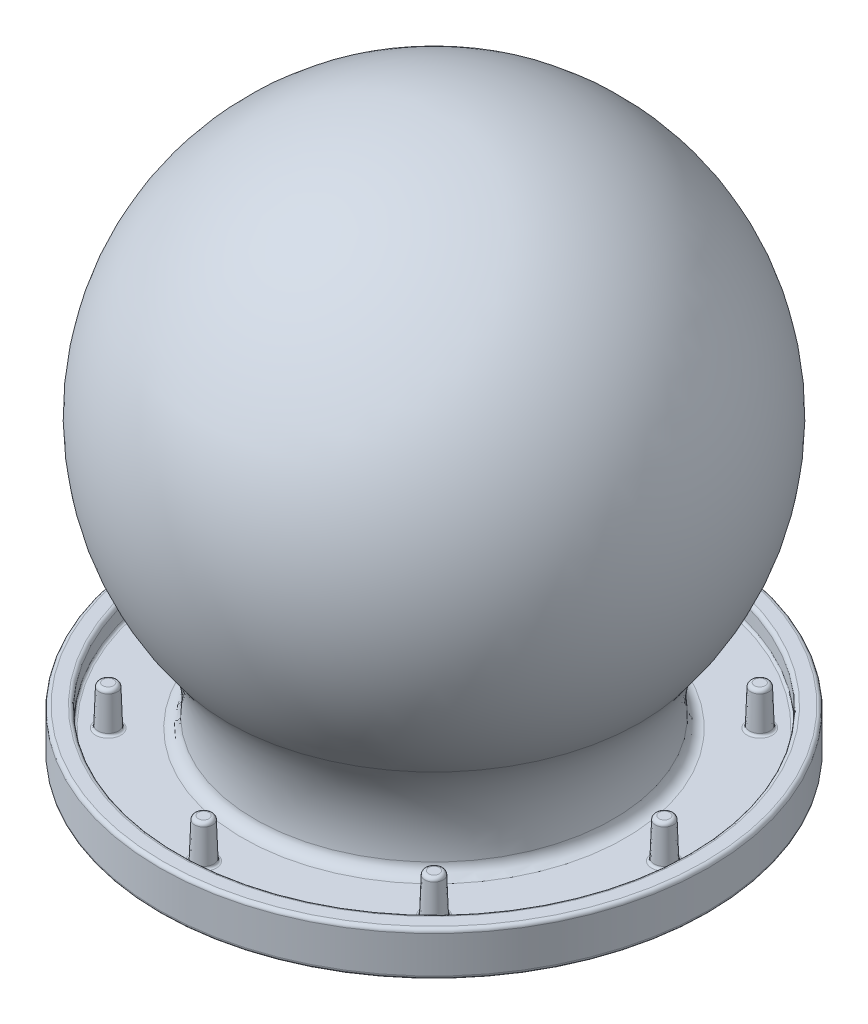
ISO-10303-21;
HEADER;
FILE_DESCRIPTION(('STEP AP214'),'2;1');
FILE_NAME('part.step','',(''),(''),'','','');
FILE_SCHEMA(('AUTOMOTIVE_DESIGN { 1 0 10303 214 1 1 1 1 }'));
ENDSEC;
DATA;
#1=APPLICATION_CONTEXT('core data for automotive mechanical design processes');
#2=APPLICATION_PROTOCOL_DEFINITION('international standard','automotive_design',2000,#1);
#3=PRODUCT_CONTEXT('',#1,'mechanical');
#4=PRODUCT('Part','Part','',(#3));
#5=PRODUCT_RELATED_PRODUCT_CATEGORY('part','',(#4));
#6=PRODUCT_DEFINITION_FORMATION('','',#4);
#7=PRODUCT_DEFINITION_CONTEXT('part definition',#1,'design');
#8=PRODUCT_DEFINITION('design','',#6,#7);
#9=PRODUCT_DEFINITION_SHAPE('','',#8);
#10=(LENGTH_UNIT() NAMED_UNIT(*) SI_UNIT(.MILLI.,.METRE.));
#11=(NAMED_UNIT(*) PLANE_ANGLE_UNIT() SI_UNIT($,.RADIAN.));
#12=(NAMED_UNIT(*) SI_UNIT($,.STERADIAN.) SOLID_ANGLE_UNIT());
#13=UNCERTAINTY_MEASURE_WITH_UNIT(LENGTH_MEASURE(1.E-05),#10,'distance_accuracy_value','');
#14=(GEOMETRIC_REPRESENTATION_CONTEXT(3) GLOBAL_UNCERTAINTY_ASSIGNED_CONTEXT((#13)) GLOBAL_UNIT_ASSIGNED_CONTEXT((#10,
#11,#12)) REPRESENTATION_CONTEXT('',''));
#15=CARTESIAN_POINT('',(0.,0.,0.));
#16=DIRECTION('',(0.,0.,1.));
#17=DIRECTION('',(1.,0.,0.));
#18=AXIS2_PLACEMENT_3D('',#15,#16,#17);
#19=CARTESIAN_POINT('',(-39.,0.,0.));
#20=DIRECTION('',(0.,1.,0.));
#21=DIRECTION('',(-1.,0.,0.));
#22=AXIS2_PLACEMENT_3D('',#19,#20,#21);
#23=PLANE('',#22);
#24=CARTESIAN_POINT('',(-33.2340187157673,0.,33.2340187157681));
#25=DIRECTION('',(0.,1.,0.));
#26=DIRECTION('',(-1.,0.,0.));
#27=AXIS2_PLACEMENT_3D('',#24,#25,#26);
#28=CIRCLE('',#27,2.58284438740354);
#29=CARTESIAN_POINT('',(-35.8168631031709,0.,33.2340187157681));
#30=VERTEX_POINT('',#29);
#31=EDGE_CURVE('E63',#30,#30,#28,.F.);
#32=ORIENTED_EDGE('',*,*,#31,.T.);
#33=EDGE_LOOP('',(#32));
#34=FACE_BOUND('',#33,.T.);
#35=CARTESIAN_POINT('',(-33.234018715768,0.,-33.2340187157674));
#36=DIRECTION('',(0.,1.,0.));
#37=DIRECTION('',(-1.,0.,0.));
#38=AXIS2_PLACEMENT_3D('',#35,#36,#37);
#39=CIRCLE('',#38,2.58284438740354);
#40=CARTESIAN_POINT('',(-35.8168631031716,0.,-33.2340187157674));
#41=VERTEX_POINT('',#40);
#42=EDGE_CURVE('E66',#41,#41,#39,.F.);
#43=ORIENTED_EDGE('',*,*,#42,.T.);
#44=EDGE_LOOP('',(#43));
#45=FACE_BOUND('',#44,.T.);
#46=CARTESIAN_POINT('',(33.2340187157676,0.,-33.2340187157679));
#47=DIRECTION('',(0.,1.,0.));
#48=DIRECTION('',(-1.,0.,0.));
#49=AXIS2_PLACEMENT_3D('',#46,#47,#48);
#50=CIRCLE('',#49,2.58284438740354);
#51=CARTESIAN_POINT('',(30.651174328364,0.,-33.2340187157679));
#52=VERTEX_POINT('',#51);
#53=EDGE_CURVE('E69',#52,#52,#50,.F.);
#54=ORIENTED_EDGE('',*,*,#53,.T.);
#55=EDGE_LOOP('',(#54));
#56=FACE_BOUND('',#55,.T.);
#57=CARTESIAN_POINT('',(33.2340187157678,0.,33.2340187157677));
#58=DIRECTION('',(0.,1.,0.));
#59=DIRECTION('',(-1.,0.,0.));
#60=AXIS2_PLACEMENT_3D('',#57,#58,#59);
#61=CIRCLE('',#60,2.58284438740354);
#62=CARTESIAN_POINT('',(30.6511743283643,0.,33.2340187157677));
#63=VERTEX_POINT('',#62);
#64=EDGE_CURVE('E72',#63,#63,#61,.F.);
#65=ORIENTED_EDGE('',*,*,#64,.T.);
#66=EDGE_LOOP('',(#65));
#67=FACE_BOUND('',#66,.T.);
#68=CARTESIAN_POINT('',(0.,0.,0.));
#69=DIRECTION('',(0.,1.,0.));
#70=DIRECTION('',(-1.,0.,0.));
#71=AXIS2_PLACEMENT_3D('',#68,#69,#70);
#72=CIRCLE('',#71,51.5);
#73=CARTESIAN_POINT('',(-51.5,0.,0.));
#74=VERTEX_POINT('',#73);
#75=EDGE_CURVE('E75',#74,#74,#72,.T.);
#76=ORIENTED_EDGE('',*,*,#75,.T.);
#77=EDGE_LOOP('',(#76));
#78=FACE_BOUND('',#77,.T.);
#79=CARTESIAN_POINT('',(0.,0.,47.));
#80=DIRECTION('',(0.,1.,0.));
#81=DIRECTION('',(-1.,0.,0.));
#82=AXIS2_PLACEMENT_3D('',#79,#80,#81);
#83=CIRCLE('',#82,2.58284438740354);
#84=CARTESIAN_POINT('',(-2.58284438740354,0.,47.));
#85=VERTEX_POINT('',#84);
#86=EDGE_CURVE('E78',#85,#85,#83,.F.);
#87=ORIENTED_EDGE('',*,*,#86,.T.);
#88=EDGE_LOOP('',(#87));
#89=FACE_BOUND('',#88,.T.);
#90=CARTESIAN_POINT('',(47.,0.,-1.64099622925627E-13));
#91=DIRECTION('',(0.,1.,0.));
#92=DIRECTION('',(-1.,0.,0.));
#93=AXIS2_PLACEMENT_3D('',#90,#91,#92);
#94=CIRCLE('',#93,2.58284438740354);
#95=CARTESIAN_POINT('',(44.4171556125965,0.,-1.64099622925627E-13));
#96=VERTEX_POINT('',#95);
#97=EDGE_CURVE('E81',#96,#96,#94,.F.);
#98=ORIENTED_EDGE('',*,*,#97,.T.);
#99=EDGE_LOOP('',(#98));
#100=FACE_BOUND('',#99,.T.);
#101=CARTESIAN_POINT('',(0.,0.,-47.));
#102=DIRECTION('',(0.,1.,0.));
#103=DIRECTION('',(-1.,0.,0.));
#104=AXIS2_PLACEMENT_3D('',#101,#102,#103);
#105=CIRCLE('',#104,2.58284438740354);
#106=CARTESIAN_POINT('',(-2.58284438740354,0.,-47.));
#107=VERTEX_POINT('',#106);
#108=EDGE_CURVE('E84',#107,#107,#105,.F.);
#109=ORIENTED_EDGE('',*,*,#108,.T.);
#110=EDGE_LOOP('',(#109));
#111=FACE_BOUND('',#110,.T.);
#112=CARTESIAN_POINT('',(-47.,0.,4.92298868776882E-13));
#113=DIRECTION('',(0.,1.,0.));
#114=DIRECTION('',(-1.,0.,0.));
#115=AXIS2_PLACEMENT_3D('',#112,#113,#114);
#116=CIRCLE('',#115,2.58284438740354);
#117=CARTESIAN_POINT('',(-49.5828443874035,0.,4.92298868776882E-13));
#118=VERTEX_POINT('',#117);
#119=EDGE_CURVE('E87',#118,#118,#116,.F.);
#120=ORIENTED_EDGE('',*,*,#119,.T.);
#121=EDGE_LOOP('',(#120));
#122=FACE_BOUND('',#121,.T.);
#123=CARTESIAN_POINT('',(0.,0.,0.));
#124=DIRECTION('',(0.,1.,0.));
#125=DIRECTION('',(-1.,0.,0.));
#126=AXIS2_PLACEMENT_3D('',#123,#124,#125);
#127=CIRCLE('',#126,39.);
#128=CARTESIAN_POINT('',(-39.,0.,0.));
#129=VERTEX_POINT('',#128);
#130=EDGE_CURVE('E177',#129,#129,#127,.T.);
#131=ORIENTED_EDGE('',*,*,#130,.F.);
#132=EDGE_LOOP('',(#131));
#133=FACE_BOUND('',#132,.T.);
#134=ADVANCED_FACE('F31',(#34,#45,#56,#67,#78,#89,#100,#111,#122,#133),#23,.T.);
#135=CARTESIAN_POINT('',(0.,2.4543326430938,0.));
#136=DIRECTION('',(0.,1.,0.));
#137=DIRECTION('',(-1.,0.,0.));
#138=AXIS2_PLACEMENT_3D('',#135,#136,#137);
#139=TOROIDAL_SURFACE('',#138,39.,2.4543326430938);
#140=ORIENTED_EDGE('',*,*,#130,.T.);
#141=EDGE_LOOP('',(#140));
#142=FACE_BOUND('',#141,.T.);
#143=CARTESIAN_POINT('',(0.,2.14290871225625,0.));
#144=DIRECTION('',(0.,1.,0.));
#145=DIRECTION('',(-1.,0.,0.));
#146=AXIS2_PLACEMENT_3D('',#143,#144,#145);
#147=CIRCLE('',#146,36.565505420368);
#148=CARTESIAN_POINT('',(-36.565505420368,2.14290871225625,0.));
#149=VERTEX_POINT('',#148);
#150=EDGE_CURVE('E165',#149,#149,#147,.T.);
#151=ORIENTED_EDGE('',*,*,#150,.F.);
#152=EDGE_LOOP('',(#151));
#153=FACE_BOUND('',#152,.T.);
#154=ADVANCED_FACE('F181',(#142,#153),#139,.F.);
#155=CARTESIAN_POINT('',(0.,5.50542527675592,0.));
#156=DIRECTION('',(0.,1.,0.));
#157=DIRECTION('',(-1.,0.,0.));
#158=AXIS2_PLACEMENT_3D('',#155,#156,#157);
#159=TOROIDAL_SURFACE('',#158,62.8513092382745,26.5);
#160=ORIENTED_EDGE('',*,*,#150,.T.);
#161=EDGE_LOOP('',(#160));
#162=FACE_BOUND('',#161,.T.);
#163=CARTESIAN_POINT('',(0.,21.9005031538305,0.));
#164=DIRECTION('',(0.,1.,0.));
#165=DIRECTION('',(-1.,0.,0.));
#166=AXIS2_PLACEMENT_3D('',#163,#164,#165);
#167=CIRCLE('',#166,42.0318130530961);
#168=CARTESIAN_POINT('',(-42.0318130530961,21.9005031538305,0.));
#169=VERTEX_POINT('',#168);
#170=EDGE_CURVE('E168',#169,#169,#167,.T.);
#171=ORIENTED_EDGE('',*,*,#170,.F.);
#172=EDGE_LOOP('',(#171));
#173=FACE_BOUND('',#172,.T.);
#174=ADVANCED_FACE('F190',(#162,#173),#159,.F.);
#175=CARTESIAN_POINT('',(0.,55.,0.));
#176=DIRECTION('',(0.,1.,0.));
#177=DIRECTION('',(1.,0.,0.));
#178=AXIS2_PLACEMENT_3D('',#175,#176,#177);
#179=SPHERICAL_SURFACE('',#178,53.5);
#180=ORIENTED_EDGE('',*,*,#170,.T.);
#181=EDGE_LOOP('',(#180));
#182=FACE_BOUND('',#181,.T.);
#183=ADVANCED_FACE('F224',(#182),#179,.T.);
#184=CARTESIAN_POINT('',(0.,85.7251008477316,0.));
#185=DIRECTION('',(0.,1.,0.));
#186=DIRECTION('',(-1.,0.,0.));
#187=AXIS2_PLACEMENT_3D('',#184,#185,#186);
#188=SPHERICAL_SURFACE('',#187,16.7748991522684);
#189=CARTESIAN_POINT('',(0.,95.,0.));
#190=DIRECTION('',(0.,1.,0.));
#191=DIRECTION('',(-1.,0.,0.));
#192=AXIS2_PLACEMENT_3D('',#189,#190,#191);
#193=CIRCLE('',#192,13.9776066364748);
#194=CARTESIAN_POINT('',(-13.9776066364748,95.,0.));
#195=VERTEX_POINT('',#194);
#196=EDGE_CURVE('E171',#195,#195,#193,.T.);
#197=ORIENTED_EDGE('',*,*,#196,.F.);
#198=EDGE_LOOP('',(#197));
#199=FACE_BOUND('',#198,.T.);
#200=ADVANCED_FACE('F220',(#199),#188,.F.);
#201=CARTESIAN_POINT('',(0.,40.,0.));
#202=DIRECTION('',(0.,1.,0.));
#203=DIRECTION('',(-1.,0.,0.));
#204=AXIS2_PLACEMENT_3D('',#201,#202,#203);
#205=DEGENERATE_TOROIDAL_SURFACE('',#204,68.9093716891165,99.4748771094845,.F.);
#206=ORIENTED_EDGE('',*,*,#196,.T.);
#207=EDGE_LOOP('',(#206));
#208=FACE_BOUND('',#207,.T.);
#209=CARTESIAN_POINT('',(0.,40.,0.));
#210=DIRECTION('',(0.,1.,0.));
#211=DIRECTION('',(-1.,0.,0.));
#212=AXIS2_PLACEMENT_3D('',#209,#210,#211);
#213=CIRCLE('',#212,30.565505420368);
#214=CARTESIAN_POINT('',(-30.565505420368,40.,0.));
#215=VERTEX_POINT('',#214);
#216=EDGE_CURVE('E174',#215,#215,#213,.T.);
#217=ORIENTED_EDGE('',*,*,#216,.F.);
#218=EDGE_LOOP('',(#217));
#219=FACE_BOUND('',#218,.T.);
#220=ADVANCED_FACE('F216',(#208,#219),#205,.T.);
#221=CARTESIAN_POINT('',(0.,110.,0.));
#222=DIRECTION('',(0.,1.,0.));
#223=DIRECTION('',(-1.,0.,0.));
#224=AXIS2_PLACEMENT_3D('',#221,#222,#223);
#225=CYLINDRICAL_SURFACE('',#224,30.565505420368);
#226=CARTESIAN_POINT('',(0.,-4.25,0.));
#227=DIRECTION('',(0.,-1.,0.));
#228=DIRECTION('',(1.,0.,0.));
#229=AXIS2_PLACEMENT_3D('',#226,#227,#228);
#230=CIRCLE('',#229,30.565505420368);
#231=CARTESIAN_POINT('',(30.565505420368,-4.25,0.));
#232=VERTEX_POINT('',#231);
#233=EDGE_CURVE('E102',#232,#232,#230,.T.);
#234=ORIENTED_EDGE('',*,*,#233,.T.);
#235=EDGE_LOOP('',(#234));
#236=FACE_BOUND('',#235,.T.);
#237=ORIENTED_EDGE('',*,*,#216,.T.);
#238=EDGE_LOOP('',(#237));
#239=FACE_BOUND('',#238,.T.);
#240=ADVANCED_FACE('F212',(#236,#239),#225,.F.);
#241=CARTESIAN_POINT('',(-56.,-5.,0.));
#242=DIRECTION('',(0.,-1.,0.));
#243=DIRECTION('',(1.,0.,0.));
#244=AXIS2_PLACEMENT_3D('',#241,#242,#243);
#245=PLANE('',#244);
#246=CARTESIAN_POINT('',(0.,-5.,0.));
#247=DIRECTION('',(0.,-1.,0.));
#248=DIRECTION('',(1.,0.,0.));
#249=AXIS2_PLACEMENT_3D('',#246,#247,#248);
#250=CIRCLE('',#249,55.25);
#251=CARTESIAN_POINT('',(55.25,-5.,0.));
#252=VERTEX_POINT('',#251);
#253=EDGE_CURVE('E105',#252,#252,#250,.T.);
#254=ORIENTED_EDGE('',*,*,#253,.T.);
#255=EDGE_LOOP('',(#254));
#256=FACE_BOUND('',#255,.T.);
#257=CARTESIAN_POINT('',(0.,-5.,0.));
#258=DIRECTION('',(0.,-1.,0.));
#259=DIRECTION('',(1.,0.,0.));
#260=AXIS2_PLACEMENT_3D('',#257,#258,#259);
#261=CIRCLE('',#260,31.315505420368);
#262=CARTESIAN_POINT('',(31.315505420368,-5.,0.));
#263=VERTEX_POINT('',#262);
#264=EDGE_CURVE('E108',#263,#263,#261,.F.);
#265=ORIENTED_EDGE('',*,*,#264,.T.);
#266=EDGE_LOOP('',(#265));
#267=FACE_BOUND('',#266,.T.);
#268=ADVANCED_FACE('F208',(#256,#267),#245,.T.);
#269=CARTESIAN_POINT('',(0.,110.,0.));
#270=DIRECTION('',(0.,1.,0.));
#271=DIRECTION('',(-1.,0.,0.));
#272=AXIS2_PLACEMENT_3D('',#269,#270,#271);
#273=CYLINDRICAL_SURFACE('',#272,56.);
#274=CARTESIAN_POINT('',(0.,-4.25,0.));
#275=DIRECTION('',(0.,-1.,0.));
#276=DIRECTION('',(1.,0.,0.));
#277=AXIS2_PLACEMENT_3D('',#274,#275,#276);
#278=CIRCLE('',#277,56.);
#279=CARTESIAN_POINT('',(56.,-4.25,0.));
#280=VERTEX_POINT('',#279);
#281=EDGE_CURVE('E111',#280,#280,#278,.F.);
#282=ORIENTED_EDGE('',*,*,#281,.T.);
#283=EDGE_LOOP('',(#282));
#284=FACE_BOUND('',#283,.T.);
#285=CARTESIAN_POINT('',(0.,3.25,0.));
#286=DIRECTION('',(0.,1.,0.));
#287=DIRECTION('',(-1.,0.,0.));
#288=AXIS2_PLACEMENT_3D('',#285,#286,#287);
#289=CIRCLE('',#288,56.);
#290=CARTESIAN_POINT('',(-56.,3.25,0.));
#291=VERTEX_POINT('',#290);
#292=EDGE_CURVE('E114',#291,#291,#289,.F.);
#293=ORIENTED_EDGE('',*,*,#292,.T.);
#294=EDGE_LOOP('',(#293));
#295=FACE_BOUND('',#294,.T.);
#296=ADVANCED_FACE('F204',(#284,#295),#273,.T.);
#297=CARTESIAN_POINT('',(-52.,4.,0.));
#298=DIRECTION('',(0.,1.,0.));
#299=DIRECTION('',(-1.,0.,0.));
#300=AXIS2_PLACEMENT_3D('',#297,#298,#299);
#301=PLANE('',#300);
#302=CARTESIAN_POINT('',(0.,4.,0.));
#303=DIRECTION('',(0.,1.,0.));
#304=DIRECTION('',(-1.,0.,0.));
#305=AXIS2_PLACEMENT_3D('',#302,#303,#304);
#306=CIRCLE('',#305,52.75);
#307=CARTESIAN_POINT('',(-52.75,4.,0.));
#308=VERTEX_POINT('',#307);
#309=EDGE_CURVE('E93',#308,#308,#306,.F.);
#310=ORIENTED_EDGE('',*,*,#309,.T.);
#311=EDGE_LOOP('',(#310));
#312=FACE_BOUND('',#311,.T.);
#313=CARTESIAN_POINT('',(0.,4.,0.));
#314=DIRECTION('',(0.,1.,0.));
#315=DIRECTION('',(-1.,0.,0.));
#316=AXIS2_PLACEMENT_3D('',#313,#314,#315);
#317=CIRCLE('',#316,55.25);
#318=CARTESIAN_POINT('',(-55.25,4.,0.));
#319=VERTEX_POINT('',#318);
#320=EDGE_CURVE('E96',#319,#319,#317,.T.);
#321=ORIENTED_EDGE('',*,*,#320,.T.);
#322=EDGE_LOOP('',(#321));
#323=FACE_BOUND('',#322,.T.);
#324=ADVANCED_FACE('F200',(#312,#323),#301,.T.);
#325=CARTESIAN_POINT('',(0.,110.,0.));
#326=DIRECTION('',(0.,1.,0.));
#327=DIRECTION('',(-1.,0.,0.));
#328=AXIS2_PLACEMENT_3D('',#325,#326,#327);
#329=CYLINDRICAL_SURFACE('',#328,52.);
#330=CARTESIAN_POINT('',(0.,0.5,0.));
#331=DIRECTION('',(0.,1.,0.));
#332=DIRECTION('',(-1.,0.,0.));
#333=AXIS2_PLACEMENT_3D('',#330,#331,#332);
#334=CIRCLE('',#333,52.);
#335=CARTESIAN_POINT('',(-52.,0.499999999999997,0.));
#336=VERTEX_POINT('',#335);
#337=EDGE_CURVE('E51',#336,#336,#334,.F.);
#338=ORIENTED_EDGE('',*,*,#337,.T.);
#339=EDGE_LOOP('',(#338));
#340=FACE_BOUND('',#339,.T.);
#341=CARTESIAN_POINT('',(0.,3.25,0.));
#342=DIRECTION('',(0.,1.,0.));
#343=DIRECTION('',(-1.,0.,0.));
#344=AXIS2_PLACEMENT_3D('',#341,#342,#343);
#345=CIRCLE('',#344,52.);
#346=CARTESIAN_POINT('',(-52.,3.25,0.));
#347=VERTEX_POINT('',#346);
#348=EDGE_CURVE('E99',#347,#347,#345,.T.);
#349=ORIENTED_EDGE('',*,*,#348,.T.);
#350=EDGE_LOOP('',(#349));
#351=FACE_BOUND('',#350,.T.);
#352=ADVANCED_FACE('F197',(#340,#351),#329,.F.);
#353=CARTESIAN_POINT('',(0.,0.,47.));
#354=DIRECTION('',(0.,-1.,0.));
#355=DIRECTION('',(-1.,0.,0.));
#356=AXIS2_PLACEMENT_3D('',#353,#354,#355);
#357=CONICAL_SURFACE('',#356,2.1,0.0349065850398867);
#358=CARTESIAN_POINT('',(0.,0.482550251648749,47.));
#359=DIRECTION('',(0.,1.,0.));
#360=DIRECTION('',(-1.,0.,0.));
#361=AXIS2_PLACEMENT_3D('',#358,#359,#360);
#362=CIRCLE('',#361,2.08314897389399);
#363=CARTESIAN_POINT('',(-2.08314897389399,0.482550251648749,47.));
#364=VERTEX_POINT('',#363);
#365=EDGE_CURVE('E46',#364,#364,#362,.T.);
#366=ORIENTED_EDGE('',*,*,#365,.T.);
#367=EDGE_LOOP('',(#366));
#368=FACE_BOUND('',#367,.T.);
#369=CARTESIAN_POINT('',(0.,7.27617462252688,47.));
#370=DIRECTION('',(0.,-1.,0.));
#371=DIRECTION('',(1.,0.,0.));
#372=AXIS2_PLACEMENT_3D('',#369,#370,#371);
#373=CIRCLE('',#372,1.84591038322503);
#374=CARTESIAN_POINT('',(1.84591038322503,7.27617462252688,47.));
#375=VERTEX_POINT('',#374);
#376=EDGE_CURVE('E159',#375,#375,#373,.T.);
#377=ORIENTED_EDGE('',*,*,#376,.T.);
#378=EDGE_LOOP('',(#377));
#379=FACE_BOUND('',#378,.T.);
#380=ADVANCED_FACE('F195',(#368,#379),#357,.T.);
#381=CARTESIAN_POINT('',(0.,8.,47.));
#382=DIRECTION('',(0.,1.,0.));
#383=DIRECTION('',(-1.,0.,0.));
#384=AXIS2_PLACEMENT_3D('',#381,#382,#383);
#385=PLANE('',#384);
#386=CARTESIAN_POINT('',(0.,8.,47.));
#387=DIRECTION('',(0.,1.,0.));
#388=DIRECTION('',(-1.,0.,0.));
#389=AXIS2_PLACEMENT_3D('',#386,#387,#388);
#390=CIRCLE('',#389,1.09636726296071);
#391=CARTESIAN_POINT('',(-1.09636726296071,8.,47.));
#392=VERTEX_POINT('',#391);
#393=EDGE_CURVE('E162',#392,#392,#390,.T.);
#394=ORIENTED_EDGE('',*,*,#393,.T.);
#395=EDGE_LOOP('',(#394));
#396=FACE_BOUND('',#395,.T.);
#397=ADVANCED_FACE('F236',(#396),#385,.T.);
#398=CARTESIAN_POINT('',(0.,7.25,47.));
#399=DIRECTION('',(0.,1.,0.));
#400=DIRECTION('',(-1.,0.,0.));
#401=AXIS2_PLACEMENT_3D('',#398,#399,#400);
#402=TOROIDAL_SURFACE('',#401,1.09636726296071,0.75);
#403=ORIENTED_EDGE('',*,*,#376,.F.);
#404=EDGE_LOOP('',(#403));
#405=FACE_BOUND('',#404,.T.);
#406=ORIENTED_EDGE('',*,*,#393,.F.);
#407=EDGE_LOOP('',(#406));
#408=FACE_BOUND('',#407,.T.);
#409=ADVANCED_FACE('F232',(#405,#408),#402,.T.);
#410=CARTESIAN_POINT('',(33.2340187157678,0.,33.2340187157677));
#411=DIRECTION('',(0.,-1.,0.));
#412=DIRECTION('',(-0.707106781186546,0.,0.707106781186549));
#413=AXIS2_PLACEMENT_3D('',#410,#411,#412);
#414=CONICAL_SURFACE('',#413,2.1,0.0349065850398867);
#415=CARTESIAN_POINT('',(33.2340187157678,0.482550251648756,33.2340187157677));
#416=DIRECTION('',(0.,1.,0.));
#417=DIRECTION('',(-1.,0.,0.));
#418=AXIS2_PLACEMENT_3D('',#415,#416,#417);
#419=CIRCLE('',#418,2.08314897389399);
#420=CARTESIAN_POINT('',(31.1508697418738,0.482550251648756,33.2340187157677));
#421=VERTEX_POINT('',#420);
#422=EDGE_CURVE('E54',#421,#421,#419,.T.);
#423=ORIENTED_EDGE('',*,*,#422,.T.);
#424=EDGE_LOOP('',(#423));
#425=FACE_BOUND('',#424,.T.);
#426=CARTESIAN_POINT('',(33.2340187157678,7.27617462252688,33.2340187157677));
#427=DIRECTION('',(0.,-1.,0.));
#428=DIRECTION('',(1.,0.,0.));
#429=AXIS2_PLACEMENT_3D('',#426,#427,#428);
#430=CIRCLE('',#429,1.84591038322503);
#431=CARTESIAN_POINT('',(35.0799290989928,7.27617462252688,33.2340187157677));
#432=VERTEX_POINT('',#431);
#433=EDGE_CURVE('E153',#432,#432,#430,.T.);
#434=ORIENTED_EDGE('',*,*,#433,.T.);
#435=EDGE_LOOP('',(#434));
#436=FACE_BOUND('',#435,.T.);
#437=ADVANCED_FACE('F235',(#425,#436),#414,.T.);
#438=CARTESIAN_POINT('',(33.2340187157678,8.,33.2340187157677));
#439=DIRECTION('',(0.,1.,0.));
#440=DIRECTION('',(-0.707106781186546,0.,0.707106781186549));
#441=AXIS2_PLACEMENT_3D('',#438,#439,#440);
#442=PLANE('',#441);
#443=CARTESIAN_POINT('',(33.2340187157678,8.,33.2340187157677));
#444=DIRECTION('',(0.,1.,0.));
#445=DIRECTION('',(-1.,0.,0.));
#446=AXIS2_PLACEMENT_3D('',#443,#444,#445);
#447=CIRCLE('',#446,1.09636726296071);
#448=CARTESIAN_POINT('',(32.1376514528071,8.,33.2340187157677));
#449=VERTEX_POINT('',#448);
#450=EDGE_CURVE('E156',#449,#449,#447,.T.);
#451=ORIENTED_EDGE('',*,*,#450,.T.);
#452=EDGE_LOOP('',(#451));
#453=FACE_BOUND('',#452,.T.);
#454=ADVANCED_FACE('F447',(#453),#442,.T.);
#455=CARTESIAN_POINT('',(47.,0.,-1.64099622925627E-13));
#456=DIRECTION('',(0.,-1.,0.));
#457=DIRECTION('',(0.,0.,1.));
#458=AXIS2_PLACEMENT_3D('',#455,#456,#457);
#459=CONICAL_SURFACE('',#458,2.1,0.0349065850398867);
#460=CARTESIAN_POINT('',(47.,0.482550251648756,-1.64099622925627E-13));
#461=DIRECTION('',(0.,1.,0.));
#462=DIRECTION('',(-1.,0.,0.));
#463=AXIS2_PLACEMENT_3D('',#460,#461,#462);
#464=CIRCLE('',#463,2.08314897389399);
#465=CARTESIAN_POINT('',(44.916851026106,0.482550251648756,-1.64099622925627E-13));
#466=VERTEX_POINT('',#465);
#467=EDGE_CURVE('E42',#466,#466,#464,.T.);
#468=ORIENTED_EDGE('',*,*,#467,.T.);
#469=EDGE_LOOP('',(#468));
#470=FACE_BOUND('',#469,.T.);
#471=CARTESIAN_POINT('',(47.,7.27617462252688,-1.64099622925627E-13));
#472=DIRECTION('',(0.,-1.,0.));
#473=DIRECTION('',(1.,0.,0.));
#474=AXIS2_PLACEMENT_3D('',#471,#472,#473);
#475=CIRCLE('',#474,1.84591038322503);
#476=CARTESIAN_POINT('',(48.845910383225,7.27617462252688,-1.64099622925627E-13));
#477=VERTEX_POINT('',#476);
#478=EDGE_CURVE('E147',#477,#477,#475,.T.);
#479=ORIENTED_EDGE('',*,*,#478,.T.);
#480=EDGE_LOOP('',(#479));
#481=FACE_BOUND('',#480,.T.);
#482=ADVANCED_FACE('F442',(#470,#481),#459,.T.);
#483=CARTESIAN_POINT('',(47.,8.,-1.64099622925627E-13));
#484=DIRECTION('',(0.,1.,0.));
#485=DIRECTION('',(0.,0.,1.));
#486=AXIS2_PLACEMENT_3D('',#483,#484,#485);
#487=PLANE('',#486);
#488=CARTESIAN_POINT('',(47.,8.,-1.64099622925627E-13));
#489=DIRECTION('',(0.,1.,0.));
#490=DIRECTION('',(-1.,0.,0.));
#491=AXIS2_PLACEMENT_3D('',#488,#489,#490);
#492=CIRCLE('',#491,1.09636726296071);
#493=CARTESIAN_POINT('',(45.9036327370393,8.,-1.64099622925627E-13));
#494=VERTEX_POINT('',#493);
#495=EDGE_CURVE('E150',#494,#494,#492,.T.);
#496=ORIENTED_EDGE('',*,*,#495,.T.);
#497=EDGE_LOOP('',(#496));
#498=FACE_BOUND('',#497,.T.);
#499=ADVANCED_FACE('F434',(#498),#487,.T.);
#500=CARTESIAN_POINT('',(33.2340187157676,0.,-33.2340187157679));
#501=DIRECTION('',(0.,-1.,0.));
#502=DIRECTION('',(0.707106781186551,0.,0.707106781186544));
#503=AXIS2_PLACEMENT_3D('',#500,#501,#502);
#504=CONICAL_SURFACE('',#503,2.1,0.0349065850398867);
#505=CARTESIAN_POINT('',(33.2340187157676,0.482550251648756,-33.2340187157679));
#506=DIRECTION('',(0.,1.,0.));
#507=DIRECTION('',(-1.,0.,0.));
#508=AXIS2_PLACEMENT_3D('',#505,#506,#507);
#509=CIRCLE('',#508,2.08314897389399);
#510=CARTESIAN_POINT('',(31.1508697418736,0.482550251648756,-33.2340187157679));
#511=VERTEX_POINT('',#510);
#512=EDGE_CURVE('E57',#511,#511,#509,.T.);
#513=ORIENTED_EDGE('',*,*,#512,.T.);
#514=EDGE_LOOP('',(#513));
#515=FACE_BOUND('',#514,.T.);
#516=CARTESIAN_POINT('',(33.2340187157676,7.27617462252688,-33.2340187157679));
#517=DIRECTION('',(0.,-1.,0.));
#518=DIRECTION('',(1.,0.,0.));
#519=AXIS2_PLACEMENT_3D('',#516,#517,#518);
#520=CIRCLE('',#519,1.84591038322503);
#521=CARTESIAN_POINT('',(35.0799290989926,7.27617462252688,-33.2340187157679));
#522=VERTEX_POINT('',#521);
#523=EDGE_CURVE('E141',#522,#522,#520,.T.);
#524=ORIENTED_EDGE('',*,*,#523,.T.);
#525=EDGE_LOOP('',(#524));
#526=FACE_BOUND('',#525,.T.);
#527=ADVANCED_FACE('F429',(#515,#526),#504,.T.);
#528=CARTESIAN_POINT('',(33.2340187157676,8.,-33.2340187157679));
#529=DIRECTION('',(0.,1.,0.));
#530=DIRECTION('',(0.707106781186551,0.,0.707106781186544));
#531=AXIS2_PLACEMENT_3D('',#528,#529,#530);
#532=PLANE('',#531);
#533=CARTESIAN_POINT('',(33.2340187157676,8.,-33.2340187157679));
#534=DIRECTION('',(0.,1.,0.));
#535=DIRECTION('',(-1.,0.,0.));
#536=AXIS2_PLACEMENT_3D('',#533,#534,#535);
#537=CIRCLE('',#536,1.09636726296071);
#538=CARTESIAN_POINT('',(32.1376514528068,8.,-33.2340187157679));
#539=VERTEX_POINT('',#538);
#540=EDGE_CURVE('E144',#539,#539,#537,.T.);
#541=ORIENTED_EDGE('',*,*,#540,.T.);
#542=EDGE_LOOP('',(#541));
#543=FACE_BOUND('',#542,.T.);
#544=ADVANCED_FACE('F422',(#543),#532,.T.);
#545=CARTESIAN_POINT('',(0.,0.,-47.));
#546=DIRECTION('',(0.,-1.,0.));
#547=DIRECTION('',(1.,0.,0.));
#548=AXIS2_PLACEMENT_3D('',#545,#546,#547);
#549=CONICAL_SURFACE('',#548,2.1,0.0349065850398867);
#550=CARTESIAN_POINT('',(0.,0.482550251648749,-47.));
#551=DIRECTION('',(0.,1.,0.));
#552=DIRECTION('',(-1.,0.,0.));
#553=AXIS2_PLACEMENT_3D('',#550,#551,#552);
#554=CIRCLE('',#553,2.08314897389399);
#555=CARTESIAN_POINT('',(-2.08314897389399,0.482550251648749,-47.));
#556=VERTEX_POINT('',#555);
#557=EDGE_CURVE('E38',#556,#556,#554,.T.);
#558=ORIENTED_EDGE('',*,*,#557,.T.);
#559=EDGE_LOOP('',(#558));
#560=FACE_BOUND('',#559,.T.);
#561=CARTESIAN_POINT('',(0.,7.27617462252688,-47.));
#562=DIRECTION('',(0.,-1.,0.));
#563=DIRECTION('',(1.,0.,0.));
#564=AXIS2_PLACEMENT_3D('',#561,#562,#563);
#565=CIRCLE('',#564,1.84591038322503);
#566=CARTESIAN_POINT('',(1.84591038322503,7.27617462252688,-47.));
#567=VERTEX_POINT('',#566);
#568=EDGE_CURVE('E135',#567,#567,#565,.T.);
#569=ORIENTED_EDGE('',*,*,#568,.T.);
#570=EDGE_LOOP('',(#569));
#571=FACE_BOUND('',#570,.T.);
#572=ADVANCED_FACE('F417',(#560,#571),#549,.T.);
#573=CARTESIAN_POINT('',(0.,8.,-47.));
#574=DIRECTION('',(0.,1.,0.));
#575=DIRECTION('',(1.,0.,0.));
#576=AXIS2_PLACEMENT_3D('',#573,#574,#575);
#577=PLANE('',#576);
#578=CARTESIAN_POINT('',(0.,8.,-47.));
#579=DIRECTION('',(0.,1.,0.));
#580=DIRECTION('',(-1.,0.,0.));
#581=AXIS2_PLACEMENT_3D('',#578,#579,#580);
#582=CIRCLE('',#581,1.09636726296071);
#583=CARTESIAN_POINT('',(-1.09636726296071,8.,-47.));
#584=VERTEX_POINT('',#583);
#585=EDGE_CURVE('E138',#584,#584,#582,.T.);
#586=ORIENTED_EDGE('',*,*,#585,.T.);
#587=EDGE_LOOP('',(#586));
#588=FACE_BOUND('',#587,.T.);
#589=ADVANCED_FACE('F409',(#588),#577,.T.);
#590=CARTESIAN_POINT('',(-33.234018715768,0.,-33.2340187157674));
#591=DIRECTION('',(0.,-1.,0.));
#592=DIRECTION('',(0.707106781186541,0.,-0.707106781186554));
#593=AXIS2_PLACEMENT_3D('',#590,#591,#592);
#594=CONICAL_SURFACE('',#593,2.1,0.0349065850398867);
#595=CARTESIAN_POINT('',(-33.234018715768,0.482550251648749,-33.2340187157674));
#596=DIRECTION('',(0.,1.,0.));
#597=DIRECTION('',(-1.,0.,0.));
#598=AXIS2_PLACEMENT_3D('',#595,#596,#597);
#599=CIRCLE('',#598,2.08314897389399);
#600=CARTESIAN_POINT('',(-35.317167689662,0.482550251648749,-33.2340187157674));
#601=VERTEX_POINT('',#600);
#602=EDGE_CURVE('E60',#601,#601,#599,.T.);
#603=ORIENTED_EDGE('',*,*,#602,.T.);
#604=EDGE_LOOP('',(#603));
#605=FACE_BOUND('',#604,.T.);
#606=CARTESIAN_POINT('',(-33.234018715768,7.27617462252687,-33.2340187157674));
#607=DIRECTION('',(0.,-1.,0.));
#608=DIRECTION('',(1.,0.,0.));
#609=AXIS2_PLACEMENT_3D('',#606,#607,#608);
#610=CIRCLE('',#609,1.84591038322503);
#611=CARTESIAN_POINT('',(-31.388108332543,7.27617462252687,-33.2340187157674));
#612=VERTEX_POINT('',#611);
#613=EDGE_CURVE('E129',#612,#612,#610,.T.);
#614=ORIENTED_EDGE('',*,*,#613,.T.);
#615=EDGE_LOOP('',(#614));
#616=FACE_BOUND('',#615,.T.);
#617=ADVANCED_FACE('F404',(#605,#616),#594,.T.);
#618=CARTESIAN_POINT('',(-33.234018715768,8.,-33.2340187157674));
#619=DIRECTION('',(0.,1.,0.));
#620=DIRECTION('',(0.707106781186541,0.,-0.707106781186554));
#621=AXIS2_PLACEMENT_3D('',#618,#619,#620);
#622=PLANE('',#621);
#623=CARTESIAN_POINT('',(-33.234018715768,8.,-33.2340187157674));
#624=DIRECTION('',(0.,1.,0.));
#625=DIRECTION('',(-1.,0.,0.));
#626=AXIS2_PLACEMENT_3D('',#623,#624,#625);
#627=CIRCLE('',#626,1.09636726296071);
#628=CARTESIAN_POINT('',(-34.3303859787287,8.,-33.2340187157674));
#629=VERTEX_POINT('',#628);
#630=EDGE_CURVE('E132',#629,#629,#627,.T.);
#631=ORIENTED_EDGE('',*,*,#630,.T.);
#632=EDGE_LOOP('',(#631));
#633=FACE_BOUND('',#632,.T.);
#634=ADVANCED_FACE('F397',(#633),#622,.T.);
#635=CARTESIAN_POINT('',(-47.,0.,4.92298868776882E-13));
#636=DIRECTION('',(0.,-1.,0.));
#637=DIRECTION('',(0.,0.,-1.));
#638=AXIS2_PLACEMENT_3D('',#635,#636,#637);
#639=CONICAL_SURFACE('',#638,2.1,0.0349065850398867);
#640=CARTESIAN_POINT('',(-47.,0.482550251648749,4.92298868776882E-13));
#641=DIRECTION('',(0.,1.,0.));
#642=DIRECTION('',(-1.,0.,0.));
#643=AXIS2_PLACEMENT_3D('',#640,#641,#642);
#644=CIRCLE('',#643,2.08314897389399);
#645=CARTESIAN_POINT('',(-49.083148973894,0.482550251648749,4.92298868776882E-13));
#646=VERTEX_POINT('',#645);
#647=EDGE_CURVE('E10',#646,#646,#644,.T.);
#648=ORIENTED_EDGE('',*,*,#647,.T.);
#649=EDGE_LOOP('',(#648));
#650=FACE_BOUND('',#649,.T.);
#651=CARTESIAN_POINT('',(-47.,7.27617462252687,4.92298868776882E-13));
#652=DIRECTION('',(0.,-1.,0.));
#653=DIRECTION('',(1.,0.,0.));
#654=AXIS2_PLACEMENT_3D('',#651,#652,#653);
#655=CIRCLE('',#654,1.84591038322503);
#656=CARTESIAN_POINT('',(-45.154089616775,7.27617462252687,4.92298868776882E-13));
#657=VERTEX_POINT('',#656);
#658=EDGE_CURVE('E123',#657,#657,#655,.T.);
#659=ORIENTED_EDGE('',*,*,#658,.T.);
#660=EDGE_LOOP('',(#659));
#661=FACE_BOUND('',#660,.T.);
#662=ADVANCED_FACE('F392',(#650,#661),#639,.T.);
#663=CARTESIAN_POINT('',(-47.,8.,4.92298868776882E-13));
#664=DIRECTION('',(0.,1.,0.));
#665=DIRECTION('',(0.,0.,-1.));
#666=AXIS2_PLACEMENT_3D('',#663,#664,#665);
#667=PLANE('',#666);
#668=CARTESIAN_POINT('',(-47.,8.,4.92298868776882E-13));
#669=DIRECTION('',(0.,1.,0.));
#670=DIRECTION('',(-1.,0.,0.));
#671=AXIS2_PLACEMENT_3D('',#668,#669,#670);
#672=CIRCLE('',#671,1.09636726296071);
#673=CARTESIAN_POINT('',(-48.0963672629607,8.,4.92298868776882E-13));
#674=VERTEX_POINT('',#673);
#675=EDGE_CURVE('E126',#674,#674,#672,.T.);
#676=ORIENTED_EDGE('',*,*,#675,.T.);
#677=EDGE_LOOP('',(#676));
#678=FACE_BOUND('',#677,.T.);
#679=ADVANCED_FACE('F382',(#678),#667,.T.);
#680=CARTESIAN_POINT('',(-33.2340187157673,0.,33.2340187157681));
#681=DIRECTION('',(0.,-1.,0.));
#682=DIRECTION('',(-0.707106781186556,0.,-0.707106781186539));
#683=AXIS2_PLACEMENT_3D('',#680,#681,#682);
#684=CONICAL_SURFACE('',#683,2.1,0.0349065850398867);
#685=CARTESIAN_POINT('',(-33.2340187157673,0.482550251648749,33.2340187157681));
#686=DIRECTION('',(0.,1.,0.));
#687=DIRECTION('',(-1.,0.,0.));
#688=AXIS2_PLACEMENT_3D('',#685,#686,#687);
#689=CIRCLE('',#688,2.08314897389399);
#690=CARTESIAN_POINT('',(-35.3171676896613,0.482550251648749,33.2340187157681));
#691=VERTEX_POINT('',#690);
#692=EDGE_CURVE('E90',#691,#691,#689,.T.);
#693=ORIENTED_EDGE('',*,*,#692,.T.);
#694=EDGE_LOOP('',(#693));
#695=FACE_BOUND('',#694,.T.);
#696=CARTESIAN_POINT('',(-33.2340187157673,7.27617462252687,33.2340187157681));
#697=DIRECTION('',(0.,-1.,0.));
#698=DIRECTION('',(1.,0.,0.));
#699=AXIS2_PLACEMENT_3D('',#696,#697,#698);
#700=CIRCLE('',#699,1.84591038322503);
#701=CARTESIAN_POINT('',(-31.3881083325423,7.27617462252687,33.2340187157681));
#702=VERTEX_POINT('',#701);
#703=EDGE_CURVE('E117',#702,#702,#700,.T.);
#704=ORIENTED_EDGE('',*,*,#703,.T.);
#705=EDGE_LOOP('',(#704));
#706=FACE_BOUND('',#705,.T.);
#707=ADVANCED_FACE('F377',(#695,#706),#684,.T.);
#708=CARTESIAN_POINT('',(-33.2340187157673,8.,33.2340187157681));
#709=DIRECTION('',(0.,1.,0.));
#710=DIRECTION('',(-0.707106781186556,0.,-0.707106781186539));
#711=AXIS2_PLACEMENT_3D('',#708,#709,#710);
#712=PLANE('',#711);
#713=CARTESIAN_POINT('',(-33.2340187157673,8.,33.2340187157681));
#714=DIRECTION('',(0.,1.,0.));
#715=DIRECTION('',(-1.,0.,0.));
#716=AXIS2_PLACEMENT_3D('',#713,#714,#715);
#717=CIRCLE('',#716,1.09636726296071);
#718=CARTESIAN_POINT('',(-34.330385978728,8.,33.2340187157681));
#719=VERTEX_POINT('',#718);
#720=EDGE_CURVE('E120',#719,#719,#717,.T.);
#721=ORIENTED_EDGE('',*,*,#720,.T.);
#722=EDGE_LOOP('',(#721));
#723=FACE_BOUND('',#722,.T.);
#724=ADVANCED_FACE('F242',(#723),#712,.T.);
#725=CARTESIAN_POINT('',(33.2340187157678,7.25,33.2340187157677));
#726=DIRECTION('',(0.,1.,0.));
#727=DIRECTION('',(-1.,0.,0.));
#728=AXIS2_PLACEMENT_3D('',#725,#726,#727);
#729=TOROIDAL_SURFACE('',#728,1.09636726296071,0.75);
#730=ORIENTED_EDGE('',*,*,#433,.F.);
#731=EDGE_LOOP('',(#730));
#732=FACE_BOUND('',#731,.T.);
#733=ORIENTED_EDGE('',*,*,#450,.F.);
#734=EDGE_LOOP('',(#733));
#735=FACE_BOUND('',#734,.T.);
#736=ADVANCED_FACE('F238',(#732,#735),#729,.T.);
#737=CARTESIAN_POINT('',(47.,7.25,-1.64099622925627E-13));
#738=DIRECTION('',(0.,1.,0.));
#739=DIRECTION('',(-1.,0.,0.));
#740=AXIS2_PLACEMENT_3D('',#737,#738,#739);
#741=TOROIDAL_SURFACE('',#740,1.09636726296071,0.75);
#742=ORIENTED_EDGE('',*,*,#478,.F.);
#743=EDGE_LOOP('',(#742));
#744=FACE_BOUND('',#743,.T.);
#745=ORIENTED_EDGE('',*,*,#495,.F.);
#746=EDGE_LOOP('',(#745));
#747=FACE_BOUND('',#746,.T.);
#748=ADVANCED_FACE('F241',(#744,#747),#741,.T.);
#749=CARTESIAN_POINT('',(33.2340187157676,7.25,-33.2340187157679));
#750=DIRECTION('',(0.,1.,0.));
#751=DIRECTION('',(-1.,0.,0.));
#752=AXIS2_PLACEMENT_3D('',#749,#750,#751);
#753=TOROIDAL_SURFACE('',#752,1.09636726296071,0.75);
#754=ORIENTED_EDGE('',*,*,#523,.F.);
#755=EDGE_LOOP('',(#754));
#756=FACE_BOUND('',#755,.T.);
#757=ORIENTED_EDGE('',*,*,#540,.F.);
#758=EDGE_LOOP('',(#757));
#759=FACE_BOUND('',#758,.T.);
#760=ADVANCED_FACE('F246',(#756,#759),#753,.T.);
#761=CARTESIAN_POINT('',(0.,7.25,-47.));
#762=DIRECTION('',(0.,1.,0.));
#763=DIRECTION('',(-1.,0.,0.));
#764=AXIS2_PLACEMENT_3D('',#761,#762,#763);
#765=TOROIDAL_SURFACE('',#764,1.09636726296071,0.75);
#766=ORIENTED_EDGE('',*,*,#568,.F.);
#767=EDGE_LOOP('',(#766));
#768=FACE_BOUND('',#767,.T.);
#769=ORIENTED_EDGE('',*,*,#585,.F.);
#770=EDGE_LOOP('',(#769));
#771=FACE_BOUND('',#770,.T.);
#772=ADVANCED_FACE('F250',(#768,#771),#765,.T.);
#773=CARTESIAN_POINT('',(-33.234018715768,7.25,-33.2340187157674));
#774=DIRECTION('',(0.,1.,0.));
#775=DIRECTION('',(-1.,0.,0.));
#776=AXIS2_PLACEMENT_3D('',#773,#774,#775);
#777=TOROIDAL_SURFACE('',#776,1.09636726296071,0.75);
#778=ORIENTED_EDGE('',*,*,#613,.F.);
#779=EDGE_LOOP('',(#778));
#780=FACE_BOUND('',#779,.T.);
#781=ORIENTED_EDGE('',*,*,#630,.F.);
#782=EDGE_LOOP('',(#781));
#783=FACE_BOUND('',#782,.T.);
#784=ADVANCED_FACE('F254',(#780,#783),#777,.T.);
#785=CARTESIAN_POINT('',(-47.,7.25,4.92298868776882E-13));
#786=DIRECTION('',(0.,1.,0.));
#787=DIRECTION('',(-1.,0.,0.));
#788=AXIS2_PLACEMENT_3D('',#785,#786,#787);
#789=TOROIDAL_SURFACE('',#788,1.09636726296071,0.75);
#790=ORIENTED_EDGE('',*,*,#658,.F.);
#791=EDGE_LOOP('',(#790));
#792=FACE_BOUND('',#791,.T.);
#793=ORIENTED_EDGE('',*,*,#675,.F.);
#794=EDGE_LOOP('',(#793));
#795=FACE_BOUND('',#794,.T.);
#796=ADVANCED_FACE('F258',(#792,#795),#789,.T.);
#797=CARTESIAN_POINT('',(-33.2340187157673,7.25,33.2340187157681));
#798=DIRECTION('',(0.,1.,0.));
#799=DIRECTION('',(-1.,0.,0.));
#800=AXIS2_PLACEMENT_3D('',#797,#798,#799);
#801=TOROIDAL_SURFACE('',#800,1.09636726296071,0.75);
#802=ORIENTED_EDGE('',*,*,#703,.F.);
#803=EDGE_LOOP('',(#802));
#804=FACE_BOUND('',#803,.T.);
#805=ORIENTED_EDGE('',*,*,#720,.F.);
#806=EDGE_LOOP('',(#805));
#807=FACE_BOUND('',#806,.T.);
#808=ADVANCED_FACE('F262',(#804,#807),#801,.T.);
#809=CARTESIAN_POINT('',(0.,-4.25,0.));
#810=DIRECTION('',(0.,-1.,0.));
#811=DIRECTION('',(1.,0.,0.));
#812=AXIS2_PLACEMENT_3D('',#809,#810,#811);
#813=TOROIDAL_SURFACE('',#812,55.25,0.75);
#814=ORIENTED_EDGE('',*,*,#253,.F.);
#815=EDGE_LOOP('',(#814));
#816=FACE_BOUND('',#815,.T.);
#817=ORIENTED_EDGE('',*,*,#281,.F.);
#818=EDGE_LOOP('',(#817));
#819=FACE_BOUND('',#818,.T.);
#820=ADVANCED_FACE('F266',(#816,#819),#813,.T.);
#821=CARTESIAN_POINT('',(0.,-4.25,0.));
#822=DIRECTION('',(0.,-1.,0.));
#823=DIRECTION('',(1.,0.,0.));
#824=AXIS2_PLACEMENT_3D('',#821,#822,#823);
#825=TOROIDAL_SURFACE('',#824,31.315505420368,0.75);
#826=ORIENTED_EDGE('',*,*,#233,.F.);
#827=EDGE_LOOP('',(#826));
#828=FACE_BOUND('',#827,.T.);
#829=ORIENTED_EDGE('',*,*,#264,.F.);
#830=EDGE_LOOP('',(#829));
#831=FACE_BOUND('',#830,.T.);
#832=ADVANCED_FACE('F270',(#828,#831),#825,.T.);
#833=CARTESIAN_POINT('',(0.,3.25,0.));
#834=DIRECTION('',(0.,1.,0.));
#835=DIRECTION('',(-1.,0.,0.));
#836=AXIS2_PLACEMENT_3D('',#833,#834,#835);
#837=TOROIDAL_SURFACE('',#836,52.75,0.75);
#838=ORIENTED_EDGE('',*,*,#309,.F.);
#839=EDGE_LOOP('',(#838));
#840=FACE_BOUND('',#839,.T.);
#841=ORIENTED_EDGE('',*,*,#348,.F.);
#842=EDGE_LOOP('',(#841));
#843=FACE_BOUND('',#842,.T.);
#844=ADVANCED_FACE('F274',(#840,#843),#837,.T.);
#845=CARTESIAN_POINT('',(0.,3.25,0.));
#846=DIRECTION('',(0.,1.,0.));
#847=DIRECTION('',(-1.,0.,0.));
#848=AXIS2_PLACEMENT_3D('',#845,#846,#847);
#849=TOROIDAL_SURFACE('',#848,55.25,0.75);
#850=ORIENTED_EDGE('',*,*,#292,.F.);
#851=EDGE_LOOP('',(#850));
#852=FACE_BOUND('',#851,.T.);
#853=ORIENTED_EDGE('',*,*,#320,.F.);
#854=EDGE_LOOP('',(#853));
#855=FACE_BOUND('',#854,.T.);
#856=ADVANCED_FACE('F278',(#852,#855),#849,.T.);
#857=CARTESIAN_POINT('',(-33.2340187157673,0.500000000000001,33.2340187157681));
#858=DIRECTION('',(0.,1.,0.));
#859=DIRECTION('',(-1.,0.,0.));
#860=AXIS2_PLACEMENT_3D('',#857,#858,#859);
#861=TOROIDAL_SURFACE('',#860,2.58284438740354,0.5);
#862=ORIENTED_EDGE('',*,*,#31,.F.);
#863=EDGE_LOOP('',(#862));
#864=FACE_BOUND('',#863,.T.);
#865=ORIENTED_EDGE('',*,*,#692,.F.);
#866=EDGE_LOOP('',(#865));
#867=FACE_BOUND('',#866,.T.);
#868=ADVANCED_FACE('F282',(#864,#867),#861,.F.);
#869=CARTESIAN_POINT('',(-33.234018715768,0.500000000000001,-33.2340187157674));
#870=DIRECTION('',(0.,1.,0.));
#871=DIRECTION('',(-1.,0.,0.));
#872=AXIS2_PLACEMENT_3D('',#869,#870,#871);
#873=TOROIDAL_SURFACE('',#872,2.58284438740354,0.5);
#874=ORIENTED_EDGE('',*,*,#42,.F.);
#875=EDGE_LOOP('',(#874));
#876=FACE_BOUND('',#875,.T.);
#877=ORIENTED_EDGE('',*,*,#602,.F.);
#878=EDGE_LOOP('',(#877));
#879=FACE_BOUND('',#878,.T.);
#880=ADVANCED_FACE('F286',(#876,#879),#873,.F.);
#881=CARTESIAN_POINT('',(33.2340187157676,0.500000000000005,-33.2340187157679));
#882=DIRECTION('',(0.,1.,0.));
#883=DIRECTION('',(-1.,0.,0.));
#884=AXIS2_PLACEMENT_3D('',#881,#882,#883);
#885=TOROIDAL_SURFACE('',#884,2.58284438740354,0.5);
#886=ORIENTED_EDGE('',*,*,#53,.F.);
#887=EDGE_LOOP('',(#886));
#888=FACE_BOUND('',#887,.T.);
#889=ORIENTED_EDGE('',*,*,#512,.F.);
#890=EDGE_LOOP('',(#889));
#891=FACE_BOUND('',#890,.T.);
#892=ADVANCED_FACE('F290',(#888,#891),#885,.F.);
#893=CARTESIAN_POINT('',(33.2340187157678,0.500000000000005,33.2340187157677));
#894=DIRECTION('',(0.,1.,0.));
#895=DIRECTION('',(-1.,0.,0.));
#896=AXIS2_PLACEMENT_3D('',#893,#894,#895);
#897=TOROIDAL_SURFACE('',#896,2.58284438740354,0.5);
#898=ORIENTED_EDGE('',*,*,#64,.F.);
#899=EDGE_LOOP('',(#898));
#900=FACE_BOUND('',#899,.T.);
#901=ORIENTED_EDGE('',*,*,#422,.F.);
#902=EDGE_LOOP('',(#901));
#903=FACE_BOUND('',#902,.T.);
#904=ADVANCED_FACE('F294',(#900,#903),#897,.F.);
#905=CARTESIAN_POINT('',(0.,0.5,0.));
#906=DIRECTION('',(0.,1.,0.));
#907=DIRECTION('',(-1.,0.,0.));
#908=AXIS2_PLACEMENT_3D('',#905,#906,#907);
#909=TOROIDAL_SURFACE('',#908,51.5,0.5);
#910=ORIENTED_EDGE('',*,*,#337,.F.);
#911=EDGE_LOOP('',(#910));
#912=FACE_BOUND('',#911,.T.);
#913=ORIENTED_EDGE('',*,*,#75,.F.);
#914=EDGE_LOOP('',(#913));
#915=FACE_BOUND('',#914,.T.);
#916=ADVANCED_FACE('F298',(#912,#915),#909,.F.);
#917=CARTESIAN_POINT('',(0.,0.500000000000003,47.));
#918=DIRECTION('',(0.,1.,0.));
#919=DIRECTION('',(-1.,0.,0.));
#920=AXIS2_PLACEMENT_3D('',#917,#918,#919);
#921=TOROIDAL_SURFACE('',#920,2.58284438740354,0.5);
#922=ORIENTED_EDGE('',*,*,#86,.F.);
#923=EDGE_LOOP('',(#922));
#924=FACE_BOUND('',#923,.T.);
#925=ORIENTED_EDGE('',*,*,#365,.F.);
#926=EDGE_LOOP('',(#925));
#927=FACE_BOUND('',#926,.T.);
#928=ADVANCED_FACE('F302',(#924,#927),#921,.F.);
#929=CARTESIAN_POINT('',(47.,0.500000000000005,-1.64099622925627E-13));
#930=DIRECTION('',(0.,1.,0.));
#931=DIRECTION('',(-1.,0.,0.));
#932=AXIS2_PLACEMENT_3D('',#929,#930,#931);
#933=TOROIDAL_SURFACE('',#932,2.58284438740354,0.5);
#934=ORIENTED_EDGE('',*,*,#97,.F.);
#935=EDGE_LOOP('',(#934));
#936=FACE_BOUND('',#935,.T.);
#937=ORIENTED_EDGE('',*,*,#467,.F.);
#938=EDGE_LOOP('',(#937));
#939=FACE_BOUND('',#938,.T.);
#940=ADVANCED_FACE('F306',(#936,#939),#933,.F.);
#941=CARTESIAN_POINT('',(0.,0.500000000000003,-47.));
#942=DIRECTION('',(0.,1.,0.));
#943=DIRECTION('',(-1.,0.,0.));
#944=AXIS2_PLACEMENT_3D('',#941,#942,#943);
#945=TOROIDAL_SURFACE('',#944,2.58284438740354,0.5);
#946=ORIENTED_EDGE('',*,*,#108,.F.);
#947=EDGE_LOOP('',(#946));
#948=FACE_BOUND('',#947,.T.);
#949=ORIENTED_EDGE('',*,*,#557,.F.);
#950=EDGE_LOOP('',(#949));
#951=FACE_BOUND('',#950,.T.);
#952=ADVANCED_FACE('F309',(#948,#951),#945,.F.);
#953=CARTESIAN_POINT('',(-47.,0.5,4.92298868776882E-13));
#954=DIRECTION('',(0.,1.,0.));
#955=DIRECTION('',(-1.,0.,0.));
#956=AXIS2_PLACEMENT_3D('',#953,#954,#955);
#957=TOROIDAL_SURFACE('',#956,2.58284438740354,0.5);
#958=ORIENTED_EDGE('',*,*,#119,.F.);
#959=EDGE_LOOP('',(#958));
#960=FACE_BOUND('',#959,.T.);
#961=ORIENTED_EDGE('',*,*,#647,.F.);
#962=EDGE_LOOP('',(#961));
#963=FACE_BOUND('',#962,.T.);
#964=ADVANCED_FACE('F33',(#960,#963),#957,.F.);
#965=CLOSED_SHELL('',(#134,#154,#174,#183,#200,#220,#240,#268,#296,#324,#352,#380,#397,#409,
#437,#454,#482,#499,#527,#544,#572,#589,#617,#634,#662,#679,#707,#724,#736,#748,#760,#772,#784,
#796,#808,#820,#832,#844,#856,#868,#880,#892,#904,#916,#928,#940,#952,#964));
#966=MANIFOLD_SOLID_BREP('B2',#965);
#967=ADVANCED_BREP_SHAPE_REPRESENTATION('',(#18,#966),#14);
#968=SHAPE_DEFINITION_REPRESENTATION(#9,#967);
ENDSEC;
END-ISO-10303-21;
